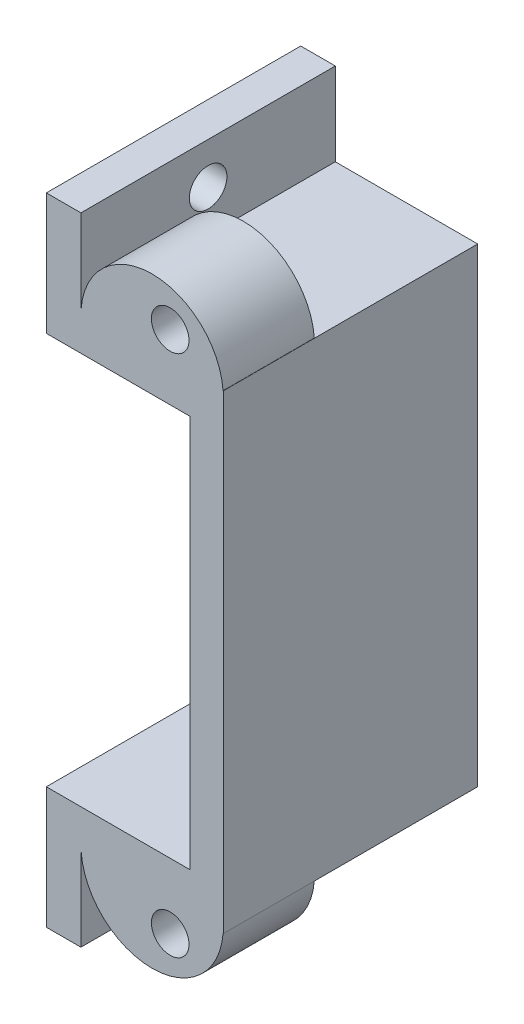
ISO-10303-21;
HEADER;
FILE_DESCRIPTION(('STEP AP214'),'2;1');
FILE_NAME('part.step','',(''),(''),'','','');
FILE_SCHEMA(('AUTOMOTIVE_DESIGN { 1 0 10303 214 1 1 1 1 }'));
ENDSEC;
DATA;
#1=APPLICATION_CONTEXT('core data for automotive mechanical design processes');
#2=APPLICATION_PROTOCOL_DEFINITION('international standard','automotive_design',2000,#1);
#3=PRODUCT_CONTEXT('',#1,'mechanical');
#4=PRODUCT('Part','Part','',(#3));
#5=PRODUCT_RELATED_PRODUCT_CATEGORY('part','',(#4));
#6=PRODUCT_DEFINITION_FORMATION('','',#4);
#7=PRODUCT_DEFINITION_CONTEXT('part definition',#1,'design');
#8=PRODUCT_DEFINITION('design','',#6,#7);
#9=PRODUCT_DEFINITION_SHAPE('','',#8);
#10=(LENGTH_UNIT() NAMED_UNIT(*) SI_UNIT(.MILLI.,.METRE.));
#11=(NAMED_UNIT(*) PLANE_ANGLE_UNIT() SI_UNIT($,.RADIAN.));
#12=(NAMED_UNIT(*) SI_UNIT($,.STERADIAN.) SOLID_ANGLE_UNIT());
#13=UNCERTAINTY_MEASURE_WITH_UNIT(LENGTH_MEASURE(1.E-05),#10,'distance_accuracy_value','');
#14=(GEOMETRIC_REPRESENTATION_CONTEXT(3) GLOBAL_UNCERTAINTY_ASSIGNED_CONTEXT((#13)) GLOBAL_UNIT_ASSIGNED_CONTEXT((#10,
#11,#12)) REPRESENTATION_CONTEXT('',''));
#15=CARTESIAN_POINT('',(0.,0.,0.));
#16=DIRECTION('',(0.,0.,1.));
#17=DIRECTION('',(1.,0.,0.));
#18=AXIS2_PLACEMENT_3D('',#15,#16,#17);
#19=CARTESIAN_POINT('',(9.56356950875785,-20.5,23.));
#20=DIRECTION('',(0.,0.,-1.));
#21=DIRECTION('',(-1.,0.,0.));
#22=AXIS2_PLACEMENT_3D('',#19,#20,#21);
#23=CYLINDRICAL_SURFACE('',#22,6.43643049124214);
#24=CARTESIAN_POINT('',(9.56356950875785,-20.5,14.75));
#25=DIRECTION('',(0.,0.,-1.));
#26=DIRECTION('',(-1.,0.,0.));
#27=AXIS2_PLACEMENT_3D('',#24,#25,#26);
#28=CIRCLE('',#27,6.43643049124214);
#29=CARTESIAN_POINT('',(15.980549909896,-21.,14.75));
#30=VERTEX_POINT('',#29);
#31=CARTESIAN_POINT('',(3.14658910761968,-21.,14.75));
#32=VERTEX_POINT('',#31);
#33=EDGE_CURVE('E155',#30,#32,#28,.T.);
#34=ORIENTED_EDGE('',*,*,#33,.F.);
#35=DIRECTION('',(0.,0.,-1.));
#36=VECTOR('',#35,1.);
#37=CARTESIAN_POINT('',(15.980549909896,-21.,23.));
#38=LINE('',#37,#36);
#39=CARTESIAN_POINT('',(15.980549909896,-21.,23.));
#40=VERTEX_POINT('',#39);
#41=EDGE_CURVE('E163',#30,#40,#38,.F.);
#42=ORIENTED_EDGE('',*,*,#41,.T.);
#43=CARTESIAN_POINT('',(9.56356950875785,-20.5,23.));
#44=DIRECTION('',(0.,0.,-1.));
#45=DIRECTION('',(1.,0.,0.));
#46=AXIS2_PLACEMENT_3D('',#43,#44,#45);
#47=CIRCLE('',#46,6.43643049124214);
#48=CARTESIAN_POINT('',(3.14658910761967,-21.,23.));
#49=VERTEX_POINT('',#48);
#50=EDGE_CURVE('E258',#49,#40,#47,.F.);
#51=ORIENTED_EDGE('',*,*,#50,.F.);
#52=DIRECTION('',(0.,0.,-1.));
#53=VECTOR('',#52,1.);
#54=CARTESIAN_POINT('',(3.14658910761967,-21.,23.));
#55=LINE('',#54,#53);
#56=EDGE_CURVE('E165',#49,#32,#55,.T.);
#57=ORIENTED_EDGE('',*,*,#56,.T.);
#58=EDGE_LOOP('',(#34,#42,#51,#57));
#59=FACE_BOUND('',#58,.T.);
#60=ADVANCED_FACE('F35',(#59),#23,.T.);
#61=CARTESIAN_POINT('',(0.,-21.,23.));
#62=DIRECTION('',(0.,1.,0.));
#63=DIRECTION('',(0.,0.,1.));
#64=AXIS2_PLACEMENT_3D('',#61,#62,#63);
#65=PLANE('',#64);
#66=DIRECTION('',(1.,0.,0.));
#67=VECTOR('',#66,1.);
#68=CARTESIAN_POINT('',(0.,-21.,0.));
#69=LINE('',#68,#67);
#70=CARTESIAN_POINT('',(3.12713901751571,-21.,0.));
#71=VERTEX_POINT('',#70);
#72=CARTESIAN_POINT('',(16.,-21.,0.));
#73=VERTEX_POINT('',#72);
#74=EDGE_CURVE('E217',#71,#73,#69,.T.);
#75=ORIENTED_EDGE('',*,*,#74,.T.);
#76=DIRECTION('',(0.,0.,-1.));
#77=VECTOR('',#76,1.);
#78=CARTESIAN_POINT('',(16.,-21.,23.));
#79=LINE('',#78,#77);
#80=CARTESIAN_POINT('',(16.,-21.,23.));
#81=VERTEX_POINT('',#80);
#82=EDGE_CURVE('E203',#81,#73,#79,.T.);
#83=ORIENTED_EDGE('',*,*,#82,.F.);
#84=DIRECTION('',(1.,0.,0.));
#85=VECTOR('',#84,1.);
#86=CARTESIAN_POINT('',(0.,-21.,23.));
#87=LINE('',#86,#85);
#88=EDGE_CURVE('E170',#40,#81,#87,.T.);
#89=ORIENTED_EDGE('',*,*,#88,.F.);
#90=ORIENTED_EDGE('',*,*,#41,.F.);
#91=DIRECTION('',(-1.,0.,0.));
#92=VECTOR('',#91,1.);
#93=CARTESIAN_POINT('',(26.1271390175157,-21.,14.75));
#94=LINE('',#93,#92);
#95=EDGE_CURVE('E152',#30,#32,#94,.T.);
#96=ORIENTED_EDGE('',*,*,#95,.T.);
#97=ORIENTED_EDGE('',*,*,#56,.F.);
#98=CARTESIAN_POINT('',(3.12713901751571,-21.,23.));
#99=VERTEX_POINT('',#98);
#100=EDGE_CURVE('E196',#99,#49,#87,.T.);
#101=ORIENTED_EDGE('',*,*,#100,.F.);
#102=DIRECTION('',(0.,0.,-1.));
#103=VECTOR('',#102,1.);
#104=CARTESIAN_POINT('',(3.12713901751571,-21.,23.));
#105=LINE('',#104,#103);
#106=EDGE_CURVE('E222',#99,#71,#105,.T.);
#107=ORIENTED_EDGE('',*,*,#106,.T.);
#108=EDGE_LOOP('',(#75,#83,#89,#90,#96,#97,#101,#107));
#109=FACE_BOUND('',#108,.T.);
#110=ADVANCED_FACE('F168',(#109),#65,.F.);
#111=CARTESIAN_POINT('',(9.56356950875785,21.,23.));
#112=DIRECTION('',(0.,0.,-1.));
#113=DIRECTION('',(-1.,0.,0.));
#114=AXIS2_PLACEMENT_3D('',#111,#112,#113);
#115=CYLINDRICAL_SURFACE('',#114,6.43643049124214);
#116=DIRECTION('',(0.,0.,-1.));
#117=VECTOR('',#116,1.);
#118=CARTESIAN_POINT('',(15.980549909896,21.5,23.));
#119=LINE('',#118,#117);
#120=CARTESIAN_POINT('',(15.980549909896,21.5,14.75));
#121=VERTEX_POINT('',#120);
#122=CARTESIAN_POINT('',(15.980549909896,21.5,23.));
#123=VERTEX_POINT('',#122);
#124=EDGE_CURVE('E292',#121,#123,#119,.F.);
#125=ORIENTED_EDGE('',*,*,#124,.F.);
#126=CARTESIAN_POINT('',(9.56356950875785,21.,14.75));
#127=DIRECTION('',(0.,0.,1.));
#128=DIRECTION('',(1.,0.,0.));
#129=AXIS2_PLACEMENT_3D('',#126,#127,#128);
#130=CIRCLE('',#129,6.43643049124214);
#131=CARTESIAN_POINT('',(3.14658910761968,21.5,14.75));
#132=VERTEX_POINT('',#131);
#133=EDGE_CURVE('E11',#132,#121,#130,.F.);
#134=ORIENTED_EDGE('',*,*,#133,.F.);
#135=DIRECTION('',(0.,0.,-1.));
#136=VECTOR('',#135,1.);
#137=CARTESIAN_POINT('',(3.14658910761967,21.5,23.));
#138=LINE('',#137,#136);
#139=CARTESIAN_POINT('',(3.14658910761967,21.5,23.));
#140=VERTEX_POINT('',#139);
#141=EDGE_CURVE('E60',#140,#132,#138,.T.);
#142=ORIENTED_EDGE('',*,*,#141,.F.);
#143=CARTESIAN_POINT('',(9.56356950875785,21.,23.));
#144=DIRECTION('',(0.,0.,1.));
#145=DIRECTION('',(1.,0.,0.));
#146=AXIS2_PLACEMENT_3D('',#143,#144,#145);
#147=CIRCLE('',#146,6.43643049124214);
#148=EDGE_CURVE('E201',#140,#123,#147,.F.);
#149=ORIENTED_EDGE('',*,*,#148,.T.);
#150=EDGE_LOOP('',(#125,#134,#142,#149));
#151=FACE_BOUND('',#150,.T.);
#152=ADVANCED_FACE('F303',(#151),#115,.T.);
#153=CARTESIAN_POINT('',(0.,0.,0.));
#154=DIRECTION('',(0.,0.,1.));
#155=DIRECTION('',(1.,0.,0.));
#156=AXIS2_PLACEMENT_3D('',#153,#154,#155);
#157=PLANE('',#156);
#158=DIRECTION('',(0.,1.,0.));
#159=VECTOR('',#158,1.);
#160=CARTESIAN_POINT('',(16.,0.,0.));
#161=LINE('',#160,#159);
#162=CARTESIAN_POINT('',(16.,21.5,0.));
#163=VERTEX_POINT('',#162);
#164=EDGE_CURVE('E182',#73,#163,#161,.T.);
#165=ORIENTED_EDGE('',*,*,#164,.F.);
#166=ORIENTED_EDGE('',*,*,#74,.F.);
#167=DIRECTION('',(0.,-1.,0.));
#168=VECTOR('',#167,1.);
#169=CARTESIAN_POINT('',(3.12713901751571,0.,0.));
#170=LINE('',#169,#168);
#171=CARTESIAN_POINT('',(3.12713901751571,-28.5,0.));
#172=VERTEX_POINT('',#171);
#173=EDGE_CURVE('E215',#71,#172,#170,.T.);
#174=ORIENTED_EDGE('',*,*,#173,.T.);
#175=DIRECTION('',(-1.,0.,0.));
#176=VECTOR('',#175,1.);
#177=CARTESIAN_POINT('',(0.,-28.5,0.));
#178=LINE('',#177,#176);
#179=CARTESIAN_POINT('',(0.,-28.5,0.));
#180=VERTEX_POINT('',#179);
#181=EDGE_CURVE('E212',#172,#180,#178,.T.);
#182=ORIENTED_EDGE('',*,*,#181,.T.);
#183=DIRECTION('',(0.,-1.,0.));
#184=VECTOR('',#183,1.);
#185=CARTESIAN_POINT('',(0.,0.,0.));
#186=LINE('',#185,#184);
#187=CARTESIAN_POINT('',(0.,-17.5,0.));
#188=VERTEX_POINT('',#187);
#189=EDGE_CURVE('E210',#188,#180,#186,.T.);
#190=ORIENTED_EDGE('',*,*,#189,.F.);
#191=DIRECTION('',(1.,0.,0.));
#192=VECTOR('',#191,1.);
#193=CARTESIAN_POINT('',(0.,-17.5,0.));
#194=LINE('',#193,#192);
#195=CARTESIAN_POINT('',(13.,-17.5,0.));
#196=VERTEX_POINT('',#195);
#197=EDGE_CURVE('E261',#188,#196,#194,.T.);
#198=ORIENTED_EDGE('',*,*,#197,.T.);
#199=DIRECTION('',(0.,-1.,0.));
#200=VECTOR('',#199,1.);
#201=CARTESIAN_POINT('',(13.,0.,0.));
#202=LINE('',#201,#200);
#203=CARTESIAN_POINT('',(13.,18.,0.));
#204=VERTEX_POINT('',#203);
#205=EDGE_CURVE('E52',#204,#196,#202,.T.);
#206=ORIENTED_EDGE('',*,*,#205,.F.);
#207=DIRECTION('',(1.,0.,0.));
#208=VECTOR('',#207,1.);
#209=CARTESIAN_POINT('',(0.,18.,0.));
#210=LINE('',#209,#208);
#211=CARTESIAN_POINT('',(0.,18.,0.));
#212=VERTEX_POINT('',#211);
#213=EDGE_CURVE('E207',#212,#204,#210,.T.);
#214=ORIENTED_EDGE('',*,*,#213,.F.);
#215=DIRECTION('',(0.,1.,0.));
#216=VECTOR('',#215,1.);
#217=CARTESIAN_POINT('',(0.,0.,0.));
#218=LINE('',#217,#216);
#219=CARTESIAN_POINT('',(0.,29.,0.));
#220=VERTEX_POINT('',#219);
#221=EDGE_CURVE('E205',#212,#220,#218,.T.);
#222=ORIENTED_EDGE('',*,*,#221,.T.);
#223=DIRECTION('',(-1.,0.,0.));
#224=VECTOR('',#223,1.);
#225=CARTESIAN_POINT('',(0.,29.,0.));
#226=LINE('',#225,#224);
#227=CARTESIAN_POINT('',(3.12713901751571,29.,0.));
#228=VERTEX_POINT('',#227);
#229=EDGE_CURVE('E257',#228,#220,#226,.T.);
#230=ORIENTED_EDGE('',*,*,#229,.F.);
#231=DIRECTION('',(0.,1.,0.));
#232=VECTOR('',#231,1.);
#233=CARTESIAN_POINT('',(3.12713901751571,0.,0.));
#234=LINE('',#233,#232);
#235=CARTESIAN_POINT('',(3.12713901751571,21.5,0.));
#236=VERTEX_POINT('',#235);
#237=EDGE_CURVE('E174',#236,#228,#234,.T.);
#238=ORIENTED_EDGE('',*,*,#237,.F.);
#239=DIRECTION('',(-1.,0.,0.));
#240=VECTOR('',#239,1.);
#241=CARTESIAN_POINT('',(0.,21.5,0.));
#242=LINE('',#241,#240);
#243=EDGE_CURVE('E44',#163,#236,#242,.T.);
#244=ORIENTED_EDGE('',*,*,#243,.F.);
#245=EDGE_LOOP('',(#165,#166,#174,#182,#190,#198,#206,#214,#222,#230,#238,#244));
#246=FACE_BOUND('',#245,.T.);
#247=ADVANCED_FACE('F305',(#246),#157,.F.);
#248=CARTESIAN_POINT('',(3.12713901751571,0.,23.));
#249=DIRECTION('',(-1.,0.,0.));
#250=DIRECTION('',(0.,0.,1.));
#251=AXIS2_PLACEMENT_3D('',#248,#249,#250);
#252=PLANE('',#251);
#253=CARTESIAN_POINT('',(3.12713901751571,25.25,11.5));
#254=DIRECTION('',(1.,0.,0.));
#255=DIRECTION('',(0.,0.,-1.));
#256=AXIS2_PLACEMENT_3D('',#253,#254,#255);
#257=CIRCLE('',#256,1.7);
#258=CARTESIAN_POINT('',(3.12713901751571,25.25,9.8));
#259=VERTEX_POINT('',#258);
#260=EDGE_CURVE('E249',#259,#259,#257,.T.);
#261=ORIENTED_EDGE('',*,*,#260,.F.);
#262=EDGE_LOOP('',(#261));
#263=FACE_BOUND('',#262,.T.);
#264=DIRECTION('',(0.,1.,0.));
#265=VECTOR('',#264,1.);
#266=CARTESIAN_POINT('',(3.12713901751571,0.,23.));
#267=LINE('',#266,#265);
#268=CARTESIAN_POINT('',(3.12713901751571,21.5,23.));
#269=VERTEX_POINT('',#268);
#270=CARTESIAN_POINT('',(3.12713901751571,29.,23.));
#271=VERTEX_POINT('',#270);
#272=EDGE_CURVE('E179',#269,#271,#267,.T.);
#273=ORIENTED_EDGE('',*,*,#272,.F.);
#274=DIRECTION('',(0.,0.,-1.));
#275=VECTOR('',#274,1.);
#276=CARTESIAN_POINT('',(3.12713901751571,21.5,23.));
#277=LINE('',#276,#275);
#278=EDGE_CURVE('E286',#269,#236,#277,.T.);
#279=ORIENTED_EDGE('',*,*,#278,.T.);
#280=ORIENTED_EDGE('',*,*,#237,.T.);
#281=DIRECTION('',(0.,0.,-1.));
#282=VECTOR('',#281,1.);
#283=CARTESIAN_POINT('',(3.12713901751571,29.,23.));
#284=LINE('',#283,#282);
#285=EDGE_CURVE('E283',#271,#228,#284,.T.);
#286=ORIENTED_EDGE('',*,*,#285,.F.);
#287=EDGE_LOOP('',(#273,#279,#280,#286));
#288=FACE_BOUND('',#287,.T.);
#289=ADVANCED_FACE('F37',(#263,#288),#252,.F.);
#290=CARTESIAN_POINT('',(0.,0.,23.));
#291=DIRECTION('',(-1.,0.,0.));
#292=DIRECTION('',(0.,-1.,0.));
#293=AXIS2_PLACEMENT_3D('',#290,#291,#292);
#294=PLANE('',#293);
#295=CARTESIAN_POINT('',(0.,25.25,11.5));
#296=DIRECTION('',(-1.,0.,0.));
#297=DIRECTION('',(0.,-1.,0.));
#298=AXIS2_PLACEMENT_3D('',#295,#296,#297);
#299=CIRCLE('',#298,1.7);
#300=CARTESIAN_POINT('',(0.,23.55,11.5));
#301=VERTEX_POINT('',#300);
#302=EDGE_CURVE('E39',#301,#301,#299,.T.);
#303=ORIENTED_EDGE('',*,*,#302,.F.);
#304=EDGE_LOOP('',(#303));
#305=FACE_BOUND('',#304,.T.);
#306=DIRECTION('',(0.,1.,0.));
#307=VECTOR('',#306,1.);
#308=CARTESIAN_POINT('',(0.,0.,23.));
#309=LINE('',#308,#307);
#310=CARTESIAN_POINT('',(0.,18.,23.));
#311=VERTEX_POINT('',#310);
#312=CARTESIAN_POINT('',(0.,29.,23.));
#313=VERTEX_POINT('',#312);
#314=EDGE_CURVE('E181',#311,#313,#309,.T.);
#315=ORIENTED_EDGE('',*,*,#314,.T.);
#316=DIRECTION('',(0.,0.,-1.));
#317=VECTOR('',#316,1.);
#318=CARTESIAN_POINT('',(0.,29.,23.));
#319=LINE('',#318,#317);
#320=EDGE_CURVE('E280',#313,#220,#319,.T.);
#321=ORIENTED_EDGE('',*,*,#320,.T.);
#322=ORIENTED_EDGE('',*,*,#221,.F.);
#323=DIRECTION('',(0.,0.,-1.));
#324=VECTOR('',#323,1.);
#325=CARTESIAN_POINT('',(0.,18.,23.));
#326=LINE('',#325,#324);
#327=EDGE_CURVE('E232',#311,#212,#326,.T.);
#328=ORIENTED_EDGE('',*,*,#327,.F.);
#329=EDGE_LOOP('',(#315,#321,#322,#328));
#330=FACE_BOUND('',#329,.T.);
#331=ADVANCED_FACE('F358',(#305,#330),#294,.T.);
#332=CARTESIAN_POINT('',(0.,18.,23.));
#333=DIRECTION('',(0.,1.,0.));
#334=DIRECTION('',(0.,0.,1.));
#335=AXIS2_PLACEMENT_3D('',#332,#333,#334);
#336=PLANE('',#335);
#337=ORIENTED_EDGE('',*,*,#213,.T.);
#338=DIRECTION('',(0.,0.,-1.));
#339=VECTOR('',#338,1.);
#340=CARTESIAN_POINT('',(13.,18.,23.));
#341=LINE('',#340,#339);
#342=CARTESIAN_POINT('',(13.,18.,23.));
#343=VERTEX_POINT('',#342);
#344=EDGE_CURVE('E230',#343,#204,#341,.T.);
#345=ORIENTED_EDGE('',*,*,#344,.F.);
#346=DIRECTION('',(1.,0.,0.));
#347=VECTOR('',#346,1.);
#348=CARTESIAN_POINT('',(0.,18.,23.));
#349=LINE('',#348,#347);
#350=EDGE_CURVE('E184',#311,#343,#349,.T.);
#351=ORIENTED_EDGE('',*,*,#350,.F.);
#352=ORIENTED_EDGE('',*,*,#327,.T.);
#353=EDGE_LOOP('',(#337,#345,#351,#352));
#354=FACE_BOUND('',#353,.T.);
#355=ADVANCED_FACE('F364',(#354),#336,.F.);
#356=CARTESIAN_POINT('',(13.,0.,23.));
#357=DIRECTION('',(1.,0.,0.));
#358=DIRECTION('',(0.,0.,-1.));
#359=AXIS2_PLACEMENT_3D('',#356,#357,#358);
#360=PLANE('',#359);
#361=ORIENTED_EDGE('',*,*,#205,.T.);
#362=DIRECTION('',(0.,0.,-1.));
#363=VECTOR('',#362,1.);
#364=CARTESIAN_POINT('',(13.,-17.5,23.));
#365=LINE('',#364,#363);
#366=CARTESIAN_POINT('',(13.,-17.5,23.));
#367=VERTEX_POINT('',#366);
#368=EDGE_CURVE('E278',#367,#196,#365,.T.);
#369=ORIENTED_EDGE('',*,*,#368,.F.);
#370=DIRECTION('',(0.,-1.,0.));
#371=VECTOR('',#370,1.);
#372=CARTESIAN_POINT('',(13.,0.,23.));
#373=LINE('',#372,#371);
#374=EDGE_CURVE('E186',#343,#367,#373,.T.);
#375=ORIENTED_EDGE('',*,*,#374,.F.);
#376=ORIENTED_EDGE('',*,*,#344,.T.);
#377=EDGE_LOOP('',(#361,#369,#375,#376));
#378=FACE_BOUND('',#377,.T.);
#379=ADVANCED_FACE('F366',(#378),#360,.F.);
#380=CARTESIAN_POINT('',(0.,0.,23.));
#381=DIRECTION('',(1.,0.,0.));
#382=DIRECTION('',(0.,1.,0.));
#383=AXIS2_PLACEMENT_3D('',#380,#381,#382);
#384=PLANE('',#383);
#385=CARTESIAN_POINT('',(0.,-24.25,11.5));
#386=DIRECTION('',(-1.,0.,0.));
#387=DIRECTION('',(0.,0.,-1.));
#388=AXIS2_PLACEMENT_3D('',#385,#386,#387);
#389=CIRCLE('',#388,1.7);
#390=CARTESIAN_POINT('',(0.,-24.25,9.8));
#391=VERTEX_POINT('',#390);
#392=EDGE_CURVE('E166',#391,#391,#389,.T.);
#393=ORIENTED_EDGE('',*,*,#392,.F.);
#394=EDGE_LOOP('',(#393));
#395=FACE_BOUND('',#394,.T.);
#396=DIRECTION('',(0.,0.,-1.));
#397=VECTOR('',#396,1.);
#398=CARTESIAN_POINT('',(0.,-28.5,23.));
#399=LINE('',#398,#397);
#400=CARTESIAN_POINT('',(0.,-28.5,23.));
#401=VERTEX_POINT('',#400);
#402=EDGE_CURVE('E227',#401,#180,#399,.T.);
#403=ORIENTED_EDGE('',*,*,#402,.F.);
#404=DIRECTION('',(0.,-1.,0.));
#405=VECTOR('',#404,1.);
#406=CARTESIAN_POINT('',(0.,0.,23.));
#407=LINE('',#406,#405);
#408=CARTESIAN_POINT('',(0.,-17.5,23.));
#409=VERTEX_POINT('',#408);
#410=EDGE_CURVE('E189',#409,#401,#407,.T.);
#411=ORIENTED_EDGE('',*,*,#410,.F.);
#412=DIRECTION('',(0.,0.,-1.));
#413=VECTOR('',#412,1.);
#414=CARTESIAN_POINT('',(0.,-17.5,23.));
#415=LINE('',#414,#413);
#416=EDGE_CURVE('E271',#409,#188,#415,.T.);
#417=ORIENTED_EDGE('',*,*,#416,.T.);
#418=ORIENTED_EDGE('',*,*,#189,.T.);
#419=EDGE_LOOP('',(#403,#411,#417,#418));
#420=FACE_BOUND('',#419,.T.);
#421=ADVANCED_FACE('F374',(#395,#420),#384,.F.);
#422=CARTESIAN_POINT('',(0.,-28.5,23.));
#423=DIRECTION('',(0.,-1.,0.));
#424=DIRECTION('',(0.,0.,-1.));
#425=AXIS2_PLACEMENT_3D('',#422,#423,#424);
#426=PLANE('',#425);
#427=ORIENTED_EDGE('',*,*,#181,.F.);
#428=DIRECTION('',(0.,0.,-1.));
#429=VECTOR('',#428,1.);
#430=CARTESIAN_POINT('',(3.12713901751571,-28.5,23.));
#431=LINE('',#430,#429);
#432=CARTESIAN_POINT('',(3.12713901751571,-28.5,23.));
#433=VERTEX_POINT('',#432);
#434=EDGE_CURVE('E224',#433,#172,#431,.T.);
#435=ORIENTED_EDGE('',*,*,#434,.F.);
#436=DIRECTION('',(-1.,0.,0.));
#437=VECTOR('',#436,1.);
#438=CARTESIAN_POINT('',(0.,-28.5,23.));
#439=LINE('',#438,#437);
#440=EDGE_CURVE('E191',#433,#401,#439,.T.);
#441=ORIENTED_EDGE('',*,*,#440,.T.);
#442=ORIENTED_EDGE('',*,*,#402,.T.);
#443=EDGE_LOOP('',(#427,#435,#441,#442));
#444=FACE_BOUND('',#443,.T.);
#445=ADVANCED_FACE('F379',(#444),#426,.T.);
#446=CARTESIAN_POINT('',(3.12713901751571,0.,23.));
#447=DIRECTION('',(1.,0.,0.));
#448=DIRECTION('',(0.,1.,0.));
#449=AXIS2_PLACEMENT_3D('',#446,#447,#448);
#450=PLANE('',#449);
#451=ORIENTED_EDGE('',*,*,#173,.F.);
#452=ORIENTED_EDGE('',*,*,#106,.F.);
#453=DIRECTION('',(0.,-1.,0.));
#454=VECTOR('',#453,1.);
#455=CARTESIAN_POINT('',(3.12713901751571,0.,23.));
#456=LINE('',#455,#454);
#457=EDGE_CURVE('E194',#99,#433,#456,.T.);
#458=ORIENTED_EDGE('',*,*,#457,.T.);
#459=ORIENTED_EDGE('',*,*,#434,.T.);
#460=EDGE_LOOP('',(#451,#452,#458,#459));
#461=FACE_BOUND('',#460,.T.);
#462=CARTESIAN_POINT('',(3.12713901751571,-24.25,11.5));
#463=DIRECTION('',(1.,0.,0.));
#464=DIRECTION('',(0.,1.,0.));
#465=AXIS2_PLACEMENT_3D('',#462,#463,#464);
#466=CIRCLE('',#465,1.7);
#467=CARTESIAN_POINT('',(3.12713901751571,-24.25,9.8));
#468=VERTEX_POINT('',#467);
#469=EDGE_CURVE('E254',#468,#468,#466,.F.);
#470=ORIENTED_EDGE('',*,*,#469,.T.);
#471=EDGE_LOOP('',(#470));
#472=FACE_BOUND('',#471,.T.);
#473=ADVANCED_FACE('F335',(#461,#472),#450,.T.);
#474=CARTESIAN_POINT('',(16.,0.,23.));
#475=DIRECTION('',(-1.,0.,0.));
#476=DIRECTION('',(0.,-1.,0.));
#477=AXIS2_PLACEMENT_3D('',#474,#475,#476);
#478=PLANE('',#477);
#479=ORIENTED_EDGE('',*,*,#164,.T.);
#480=DIRECTION('',(0.,0.,-1.));
#481=VECTOR('',#480,1.);
#482=CARTESIAN_POINT('',(16.,21.5,23.));
#483=LINE('',#482,#481);
#484=CARTESIAN_POINT('',(16.,21.5,23.));
#485=VERTEX_POINT('',#484);
#486=EDGE_CURVE('E289',#485,#163,#483,.T.);
#487=ORIENTED_EDGE('',*,*,#486,.F.);
#488=DIRECTION('',(0.,1.,0.));
#489=VECTOR('',#488,1.);
#490=CARTESIAN_POINT('',(16.,0.,23.));
#491=LINE('',#490,#489);
#492=EDGE_CURVE('E199',#81,#485,#491,.T.);
#493=ORIENTED_EDGE('',*,*,#492,.F.);
#494=ORIENTED_EDGE('',*,*,#82,.T.);
#495=EDGE_LOOP('',(#479,#487,#493,#494));
#496=FACE_BOUND('',#495,.T.);
#497=ADVANCED_FACE('F331',(#496),#478,.F.);
#498=CARTESIAN_POINT('',(0.,0.,23.));
#499=DIRECTION('',(0.,0.,1.));
#500=DIRECTION('',(1.,0.,0.));
#501=AXIS2_PLACEMENT_3D('',#498,#499,#500);
#502=PLANE('',#501);
#503=CARTESIAN_POINT('',(11.2,-23.4,23.));
#504=DIRECTION('',(0.,0.,-1.));
#505=DIRECTION('',(1.,0.,0.));
#506=AXIS2_PLACEMENT_3D('',#503,#504,#505);
#507=CIRCLE('',#506,1.7);
#508=CARTESIAN_POINT('',(12.9,-23.4,23.));
#509=VERTEX_POINT('',#508);
#510=EDGE_CURVE('E239',#509,#509,#507,.T.);
#511=ORIENTED_EDGE('',*,*,#510,.T.);
#512=EDGE_LOOP('',(#511));
#513=FACE_BOUND('',#512,.T.);
#514=CARTESIAN_POINT('',(11.2,23.9,23.));
#515=DIRECTION('',(0.,0.,1.));
#516=DIRECTION('',(1.,0.,0.));
#517=AXIS2_PLACEMENT_3D('',#514,#515,#516);
#518=CIRCLE('',#517,1.7);
#519=CARTESIAN_POINT('',(12.9,23.9,23.));
#520=VERTEX_POINT('',#519);
#521=EDGE_CURVE('E236',#520,#520,#518,.T.);
#522=ORIENTED_EDGE('',*,*,#521,.F.);
#523=EDGE_LOOP('',(#522));
#524=FACE_BOUND('',#523,.T.);
#525=ORIENTED_EDGE('',*,*,#148,.F.);
#526=DIRECTION('',(1.,0.,0.));
#527=VECTOR('',#526,1.);
#528=CARTESIAN_POINT('',(0.,21.5,23.));
#529=LINE('',#528,#527);
#530=EDGE_CURVE('E262',#269,#140,#529,.T.);
#531=ORIENTED_EDGE('',*,*,#530,.F.);
#532=ORIENTED_EDGE('',*,*,#272,.T.);
#533=DIRECTION('',(-1.,0.,0.));
#534=VECTOR('',#533,1.);
#535=CARTESIAN_POINT('',(0.,29.,23.));
#536=LINE('',#535,#534);
#537=EDGE_CURVE('E265',#271,#313,#536,.T.);
#538=ORIENTED_EDGE('',*,*,#537,.T.);
#539=ORIENTED_EDGE('',*,*,#314,.F.);
#540=ORIENTED_EDGE('',*,*,#350,.T.);
#541=ORIENTED_EDGE('',*,*,#374,.T.);
#542=DIRECTION('',(1.,0.,0.));
#543=VECTOR('',#542,1.);
#544=CARTESIAN_POINT('',(0.,-17.5,23.));
#545=LINE('',#544,#543);
#546=EDGE_CURVE('E268',#409,#367,#545,.T.);
#547=ORIENTED_EDGE('',*,*,#546,.F.);
#548=ORIENTED_EDGE('',*,*,#410,.T.);
#549=ORIENTED_EDGE('',*,*,#440,.F.);
#550=ORIENTED_EDGE('',*,*,#457,.F.);
#551=ORIENTED_EDGE('',*,*,#100,.T.);
#552=ORIENTED_EDGE('',*,*,#50,.T.);
#553=ORIENTED_EDGE('',*,*,#88,.T.);
#554=ORIENTED_EDGE('',*,*,#492,.T.);
#555=EDGE_CURVE('E260',#123,#485,#529,.T.);
#556=ORIENTED_EDGE('',*,*,#555,.F.);
#557=EDGE_LOOP('',(#525,#531,#532,#538,#539,#540,#541,#547,#548,#549,#550,#551,#552,#553,#554,#556));
#558=FACE_BOUND('',#557,.T.);
#559=ADVANCED_FACE('F300',(#513,#524,#558),#502,.T.);
#560=CARTESIAN_POINT('',(26.1271390175157,0.,14.75));
#561=DIRECTION('',(0.,0.,1.));
#562=DIRECTION('',(1.,0.,0.));
#563=AXIS2_PLACEMENT_3D('',#560,#561,#562);
#564=PLANE('',#563);
#565=CARTESIAN_POINT('',(11.2,23.9,14.75));
#566=DIRECTION('',(0.,0.,1.));
#567=DIRECTION('',(1.,0.,0.));
#568=AXIS2_PLACEMENT_3D('',#565,#566,#567);
#569=CIRCLE('',#568,1.7);
#570=CARTESIAN_POINT('',(12.9,23.9,14.75));
#571=VERTEX_POINT('',#570);
#572=EDGE_CURVE('E159',#571,#571,#569,.T.);
#573=ORIENTED_EDGE('',*,*,#572,.T.);
#574=EDGE_LOOP('',(#573));
#575=FACE_BOUND('',#574,.T.);
#576=ORIENTED_EDGE('',*,*,#133,.T.);
#577=DIRECTION('',(-1.,0.,0.));
#578=VECTOR('',#577,1.);
#579=CARTESIAN_POINT('',(26.1271390175157,21.5,14.75));
#580=LINE('',#579,#578);
#581=EDGE_CURVE('E172',#121,#132,#580,.T.);
#582=ORIENTED_EDGE('',*,*,#581,.T.);
#583=EDGE_LOOP('',(#576,#582));
#584=FACE_BOUND('',#583,.T.);
#585=ADVANCED_FACE('F326',(#575,#584),#564,.F.);
#586=CARTESIAN_POINT('',(26.1271390175157,21.5,0.));
#587=DIRECTION('',(0.,1.,0.));
#588=DIRECTION('',(0.,0.,1.));
#589=AXIS2_PLACEMENT_3D('',#586,#587,#588);
#590=PLANE('',#589);
#591=ORIENTED_EDGE('',*,*,#243,.T.);
#592=ORIENTED_EDGE('',*,*,#278,.F.);
#593=ORIENTED_EDGE('',*,*,#530,.T.);
#594=ORIENTED_EDGE('',*,*,#141,.T.);
#595=ORIENTED_EDGE('',*,*,#581,.F.);
#596=ORIENTED_EDGE('',*,*,#124,.T.);
#597=ORIENTED_EDGE('',*,*,#555,.T.);
#598=ORIENTED_EDGE('',*,*,#486,.T.);
#599=EDGE_LOOP('',(#591,#592,#593,#594,#595,#596,#597,#598));
#600=FACE_BOUND('',#599,.T.);
#601=ADVANCED_FACE('F297',(#600),#590,.T.);
#602=CARTESIAN_POINT('',(0.,-17.5,23.));
#603=DIRECTION('',(0.,1.,0.));
#604=DIRECTION('',(0.,0.,1.));
#605=AXIS2_PLACEMENT_3D('',#602,#603,#604);
#606=PLANE('',#605);
#607=ORIENTED_EDGE('',*,*,#197,.F.);
#608=ORIENTED_EDGE('',*,*,#416,.F.);
#609=ORIENTED_EDGE('',*,*,#546,.T.);
#610=ORIENTED_EDGE('',*,*,#368,.T.);
#611=EDGE_LOOP('',(#607,#608,#609,#610));
#612=FACE_BOUND('',#611,.T.);
#613=ADVANCED_FACE('F325',(#612),#606,.T.);
#614=CARTESIAN_POINT('',(0.,29.,23.));
#615=DIRECTION('',(0.,-1.,0.));
#616=DIRECTION('',(0.,0.,-1.));
#617=AXIS2_PLACEMENT_3D('',#614,#615,#616);
#618=PLANE('',#617);
#619=ORIENTED_EDGE('',*,*,#229,.T.);
#620=ORIENTED_EDGE('',*,*,#320,.F.);
#621=ORIENTED_EDGE('',*,*,#537,.F.);
#622=ORIENTED_EDGE('',*,*,#285,.T.);
#623=EDGE_LOOP('',(#619,#620,#621,#622));
#624=FACE_BOUND('',#623,.T.);
#625=ADVANCED_FACE('F321',(#624),#618,.F.);
#626=CARTESIAN_POINT('',(0.,-24.25,11.5));
#627=DIRECTION('',(1.,0.,0.));
#628=DIRECTION('',(0.,0.,-1.));
#629=AXIS2_PLACEMENT_3D('',#626,#627,#628);
#630=CYLINDRICAL_SURFACE('',#629,1.7);
#631=CARTESIAN_POINT('',(3.12713901751571,-24.25,9.8));
#632=CARTESIAN_POINT('',(3.09456465274993,-24.25,9.8));
#633=CARTESIAN_POINT('',(3.06199028798414,-24.25,9.8));
#634=CARTESIAN_POINT('',(2.99684155845256,-24.25,9.8));
#635=CARTESIAN_POINT('',(2.96426719368677,-24.25,9.8));
#636=CARTESIAN_POINT('',(2.89911846415519,-24.25,9.8));
#637=CARTESIAN_POINT('',(2.86654409938941,-24.25,9.8));
#638=CARTESIAN_POINT('',(2.80139536985783,-24.25,9.8));
#639=CARTESIAN_POINT('',(2.76882100509204,-24.25,9.8));
#640=CARTESIAN_POINT('',(2.70367227556046,-24.25,9.8));
#641=CARTESIAN_POINT('',(2.67109791079467,-24.25,9.8));
#642=CARTESIAN_POINT('',(2.6059491812631,-24.25,9.8));
#643=CARTESIAN_POINT('',(2.57337481649731,-24.25,9.8));
#644=CARTESIAN_POINT('',(2.50822608696573,-24.25,9.8));
#645=CARTESIAN_POINT('',(2.47565172219994,-24.25,9.8));
#646=CARTESIAN_POINT('',(2.41050299266836,-24.25,9.8));
#647=CARTESIAN_POINT('',(2.37792862790257,-24.25,9.8));
#648=CARTESIAN_POINT('',(2.312779898371,-24.25,9.8));
#649=CARTESIAN_POINT('',(2.28020553360521,-24.25,9.8));
#650=CARTESIAN_POINT('',(2.21505680407363,-24.25,9.8));
#651=CARTESIAN_POINT('',(2.18248243930784,-24.25,9.8));
#652=CARTESIAN_POINT('',(2.11733370977626,-24.25,9.8));
#653=CARTESIAN_POINT('',(2.08475934501048,-24.25,9.8));
#654=CARTESIAN_POINT('',(2.0196106154789,-24.25,9.8));
#655=CARTESIAN_POINT('',(1.98703625071311,-24.25,9.8));
#656=CARTESIAN_POINT('',(1.92188752118153,-24.25,9.8));
#657=CARTESIAN_POINT('',(1.88931315641574,-24.25,9.8));
#658=CARTESIAN_POINT('',(1.82416442688417,-24.25,9.8));
#659=CARTESIAN_POINT('',(1.79159006211838,-24.25,9.8));
#660=CARTESIAN_POINT('',(1.7264413325868,-24.25,9.8));
#661=CARTESIAN_POINT('',(1.69386696782101,-24.25,9.8));
#662=CARTESIAN_POINT('',(1.62871823828943,-24.25,9.8));
#663=CARTESIAN_POINT('',(1.59614387352365,-24.25,9.8));
#664=CARTESIAN_POINT('',(1.53099514399207,-24.25,9.8));
#665=CARTESIAN_POINT('',(1.49842077922628,-24.25,9.8));
#666=CARTESIAN_POINT('',(1.4332720496947,-24.25,9.8));
#667=CARTESIAN_POINT('',(1.40069768492891,-24.25,9.8));
#668=CARTESIAN_POINT('',(1.33554895539734,-24.25,9.8));
#669=CARTESIAN_POINT('',(1.30297459063155,-24.25,9.8));
#670=CARTESIAN_POINT('',(1.23782586109997,-24.25,9.8));
#671=CARTESIAN_POINT('',(1.20525149633418,-24.25,9.8));
#672=CARTESIAN_POINT('',(1.1401027668026,-24.25,9.8));
#673=CARTESIAN_POINT('',(1.10752840203682,-24.25,9.8));
#674=CARTESIAN_POINT('',(1.04237967250524,-24.25,9.8));
#675=CARTESIAN_POINT('',(1.00980530773945,-24.25,9.8));
#676=CARTESIAN_POINT('',(0.944656578207873,-24.25,9.8));
#677=CARTESIAN_POINT('',(0.912082213442084,-24.25,9.8));
#678=CARTESIAN_POINT('',(0.846933483910506,-24.25,9.8));
#679=CARTESIAN_POINT('',(0.814359119144718,-24.25,9.8));
#680=CARTESIAN_POINT('',(0.74921038961314,-24.25,9.8));
#681=CARTESIAN_POINT('',(0.716636024847352,-24.25,9.8));
#682=CARTESIAN_POINT('',(0.651487295315774,-24.25,9.8));
#683=CARTESIAN_POINT('',(0.618912930549986,-24.25,9.8));
#684=CARTESIAN_POINT('',(0.553764201018408,-24.25,9.8));
#685=CARTESIAN_POINT('',(0.521189836252619,-24.25,9.8));
#686=CARTESIAN_POINT('',(0.456041106721042,-24.25,9.8));
#687=CARTESIAN_POINT('',(0.423466741955253,-24.25,9.8));
#688=CARTESIAN_POINT('',(0.358318012423676,-24.25,9.8));
#689=CARTESIAN_POINT('',(0.325743647657887,-24.25,9.8));
#690=CARTESIAN_POINT('',(0.26059491812631,-24.25,9.8));
#691=CARTESIAN_POINT('',(0.228020553360521,-24.25,9.8));
#692=CARTESIAN_POINT('',(0.162871823828944,-24.25,9.8));
#693=CARTESIAN_POINT('',(0.130297459063155,-24.25,9.8));
#694=CARTESIAN_POINT('',(0.0651487295315778,-24.25,9.8));
#695=CARTESIAN_POINT('',(0.0325743647657891,-24.25,9.8));
#696=CARTESIAN_POINT('',(0.,-24.25,9.8));
#697=B_SPLINE_CURVE_WITH_KNOTS('',3,(#631,#632,#633,#634,#635,#636,#637,#638,#639,#640,#641,
#642,#643,#644,#645,#646,#647,#648,#649,#650,#651,#652,#653,#654,#655,#656,#657,#658,#659,#660,
#661,#662,#663,#664,#665,#666,#667,#668,#669,#670,#671,#672,#673,#674,#675,#676,#677,#678,#679,
#680,#681,#682,#683,#684,#685,#686,#687,#688,#689,#690,#691,#692,#693,#694,#695,#696),
.UNSPECIFIED.,.F.,.F.,(4,2,2,2,2,2,2,2,2,2,2,2,2,2,2,2,2,2,2,2,2,2,2,2,2,2,2,2,2,2,2,2,4),(0.,
0.097723094297366,0.195446188594732,0.293169282892098,0.390892377189464,0.48861547148683,
0.586338565784196,0.684061660081562,0.781784754378929,0.879507848676295,0.977230942973661,
1.07495403727103,1.17267713156839,1.27040022586576,1.36812332016312,1.46584641446049,
1.56356950875786,1.66129260305522,1.75901569735259,1.85673879164996,1.95446188594732,
2.05218498024469,2.14990807454205,2.24763116883942,2.34535426313679,2.44307735743415,
2.54080045173152,2.63852354602888,2.73624664032625,2.83396973462362,2.93169282892098,
3.02941592321835,3.12713901751571),.UNSPECIFIED.);
#698=EDGE_CURVE('BSEAM390',#468,#391,#697,.T.);
#699=ORIENTED_EDGE('',*,*,#469,.F.);
#700=ORIENTED_EDGE('',*,*,#392,.T.);
#701=ORIENTED_EDGE('',*,*,#698,.T.);
#702=ORIENTED_EDGE('',*,*,#698,.F.);
#703=EDGE_LOOP('',(#699,#701,#700,#702));
#704=FACE_BOUND('',#703,.T.);
#705=ADVANCED_FACE('F390',(#704),#630,.F.);
#706=CARTESIAN_POINT('',(26.1271390175157,0.500000000000007,14.75));
#707=DIRECTION('',(0.,0.,-1.));
#708=DIRECTION('',(-1.,0.,0.));
#709=AXIS2_PLACEMENT_3D('',#706,#707,#708);
#710=PLANE('',#709);
#711=CARTESIAN_POINT('',(11.2,-23.4,14.75));
#712=DIRECTION('',(0.,0.,-1.));
#713=DIRECTION('',(-1.,0.,0.));
#714=AXIS2_PLACEMENT_3D('',#711,#712,#713);
#715=CIRCLE('',#714,1.7);
#716=CARTESIAN_POINT('',(9.49999999999999,-23.4,14.75));
#717=VERTEX_POINT('',#716);
#718=EDGE_CURVE('E237',#717,#717,#715,.F.);
#719=ORIENTED_EDGE('',*,*,#718,.T.);
#720=EDGE_LOOP('',(#719));
#721=FACE_BOUND('',#720,.T.);
#722=ORIENTED_EDGE('',*,*,#33,.T.);
#723=ORIENTED_EDGE('',*,*,#95,.F.);
#724=EDGE_LOOP('',(#722,#723));
#725=FACE_BOUND('',#724,.T.);
#726=ADVANCED_FACE('F154',(#721,#725),#710,.T.);
#727=CARTESIAN_POINT('',(11.2,23.9,0.));
#728=DIRECTION('',(0.,0.,1.));
#729=DIRECTION('',(1.,0.,0.));
#730=AXIS2_PLACEMENT_3D('',#727,#728,#729);
#731=CYLINDRICAL_SURFACE('',#730,1.7);
#732=ORIENTED_EDGE('',*,*,#521,.T.);
#733=EDGE_LOOP('',(#732));
#734=FACE_BOUND('',#733,.T.);
#735=ORIENTED_EDGE('',*,*,#572,.F.);
#736=EDGE_LOOP('',(#735));
#737=FACE_BOUND('',#736,.T.);
#738=ADVANCED_FACE('F340',(#734,#737),#731,.F.);
#739=CARTESIAN_POINT('',(11.2,-23.4,0.));
#740=DIRECTION('',(0.,0.,1.));
#741=DIRECTION('',(1.,0.,0.));
#742=AXIS2_PLACEMENT_3D('',#739,#740,#741);
#743=CYLINDRICAL_SURFACE('',#742,1.7);
#744=ORIENTED_EDGE('',*,*,#718,.F.);
#745=EDGE_LOOP('',(#744));
#746=FACE_BOUND('',#745,.T.);
#747=ORIENTED_EDGE('',*,*,#510,.F.);
#748=EDGE_LOOP('',(#747));
#749=FACE_BOUND('',#748,.T.);
#750=ADVANCED_FACE('F343',(#746,#749),#743,.F.);
#751=CARTESIAN_POINT('',(-19.8728609824843,25.25,11.5));
#752=DIRECTION('',(1.,0.,0.));
#753=DIRECTION('',(0.,0.,-1.));
#754=AXIS2_PLACEMENT_3D('',#751,#752,#753);
#755=CYLINDRICAL_SURFACE('',#754,1.7);
#756=ORIENTED_EDGE('',*,*,#302,.T.);
#757=EDGE_LOOP('',(#756));
#758=FACE_BOUND('',#757,.T.);
#759=ORIENTED_EDGE('',*,*,#260,.T.);
#760=EDGE_LOOP('',(#759));
#761=FACE_BOUND('',#760,.T.);
#762=ADVANCED_FACE('F414',(#758,#761),#755,.F.);
#763=CLOSED_SHELL('',(#60,#110,#152,#247,#289,#331,#355,#379,#421,#445,#473,#497,#559,#585,#601,
#613,#625,#705,#726,#738,#750,#762));
#764=MANIFOLD_SOLID_BREP('B2',#763);
#765=ADVANCED_BREP_SHAPE_REPRESENTATION('',(#18,#764),#14);
#766=SHAPE_DEFINITION_REPRESENTATION(#9,#765);
ENDSEC;
END-ISO-10303-21;
